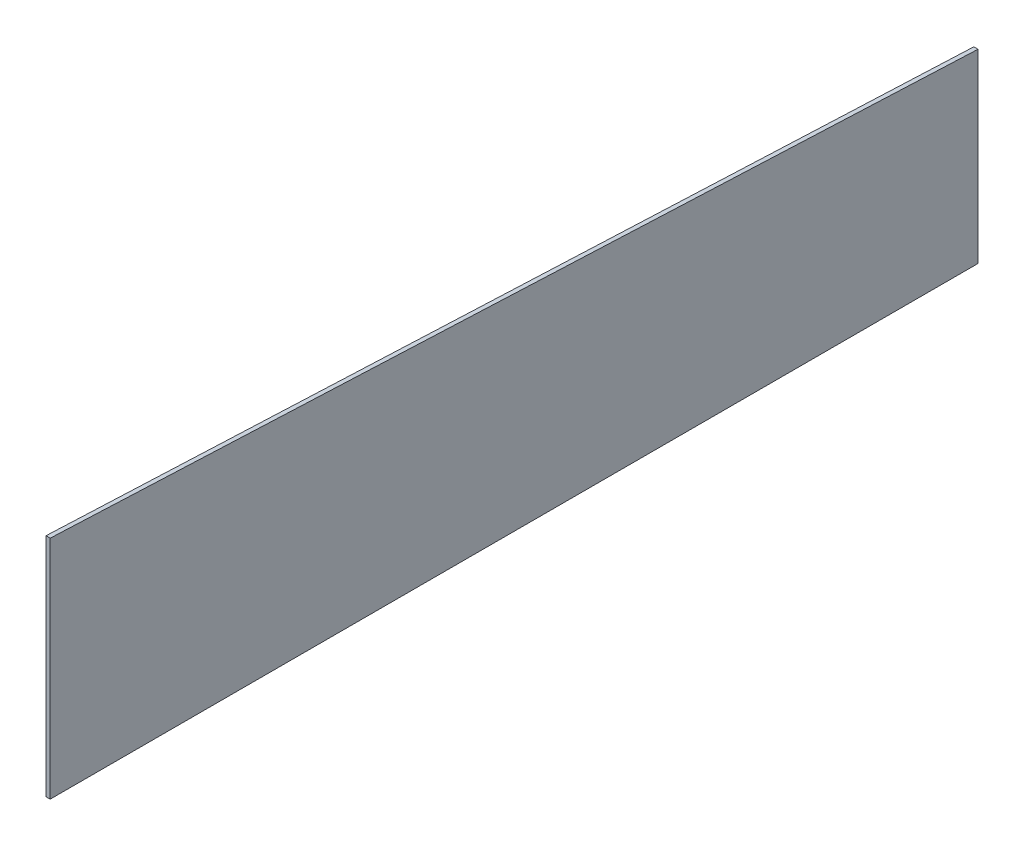
ISO-10303-21;
HEADER;
FILE_DESCRIPTION(('STEP AP214'),'2;1');
FILE_NAME('part.step','',(''),(''),'','','');
FILE_SCHEMA(('AUTOMOTIVE_DESIGN { 1 0 10303 214 1 1 1 1 }'));
ENDSEC;
DATA;
#1=APPLICATION_CONTEXT('core data for automotive mechanical design processes');
#2=APPLICATION_PROTOCOL_DEFINITION('international standard','automotive_design',2000,#1);
#3=PRODUCT_CONTEXT('',#1,'mechanical');
#4=PRODUCT('Part','Part','',(#3));
#5=PRODUCT_RELATED_PRODUCT_CATEGORY('part','',(#4));
#6=PRODUCT_DEFINITION_FORMATION('','',#4);
#7=PRODUCT_DEFINITION_CONTEXT('part definition',#1,'design');
#8=PRODUCT_DEFINITION('design','',#6,#7);
#9=PRODUCT_DEFINITION_SHAPE('','',#8);
#10=(LENGTH_UNIT() NAMED_UNIT(*) SI_UNIT(.MILLI.,.METRE.));
#11=(NAMED_UNIT(*) PLANE_ANGLE_UNIT() SI_UNIT($,.RADIAN.));
#12=(NAMED_UNIT(*) SI_UNIT($,.STERADIAN.) SOLID_ANGLE_UNIT());
#13=UNCERTAINTY_MEASURE_WITH_UNIT(LENGTH_MEASURE(1.E-05),#10,'distance_accuracy_value','');
#14=(GEOMETRIC_REPRESENTATION_CONTEXT(3) GLOBAL_UNCERTAINTY_ASSIGNED_CONTEXT((#13)) GLOBAL_UNIT_ASSIGNED_CONTEXT((#10,
#11,#12)) REPRESENTATION_CONTEXT('',''));
#15=CARTESIAN_POINT('',(0.,0.,0.));
#16=DIRECTION('',(0.,0.,1.));
#17=DIRECTION('',(1.,0.,0.));
#18=AXIS2_PLACEMENT_3D('',#15,#16,#17);
#19=CARTESIAN_POINT('',(3.175,0.,0.));
#20=DIRECTION('',(0.,1.,0.));
#21=DIRECTION('',(0.,0.,1.));
#22=AXIS2_PLACEMENT_3D('',#19,#20,#21);
#23=PLANE('',#22);
#24=DIRECTION('',(0.,0.,-1.));
#25=VECTOR('',#24,1.);
#26=CARTESIAN_POINT('',(0.,0.,0.));
#27=LINE('',#26,#25);
#28=CARTESIAN_POINT('',(0.,0.,0.));
#29=VERTEX_POINT('',#28);
#30=CARTESIAN_POINT('',(0.,0.,-698.5));
#31=VERTEX_POINT('',#30);
#32=EDGE_CURVE('E95',#29,#31,#27,.T.);
#33=ORIENTED_EDGE('',*,*,#32,.T.);
#34=DIRECTION('',(-1.,0.,0.));
#35=VECTOR('',#34,1.);
#36=CARTESIAN_POINT('',(3.175,0.,-698.5));
#37=LINE('',#36,#35);
#38=CARTESIAN_POINT('',(3.175,0.,-698.5));
#39=VERTEX_POINT('',#38);
#40=EDGE_CURVE('E48',#39,#31,#37,.T.);
#41=ORIENTED_EDGE('',*,*,#40,.F.);
#42=DIRECTION('',(0.,0.,-1.));
#43=VECTOR('',#42,1.);
#44=CARTESIAN_POINT('',(3.175,0.,0.));
#45=LINE('',#44,#43);
#46=CARTESIAN_POINT('',(3.175,0.,0.));
#47=VERTEX_POINT('',#46);
#48=EDGE_CURVE('E87',#47,#39,#45,.T.);
#49=ORIENTED_EDGE('',*,*,#48,.F.);
#50=DIRECTION('',(-1.,0.,0.));
#51=VECTOR('',#50,1.);
#52=CARTESIAN_POINT('',(3.175,0.,0.));
#53=LINE('',#52,#51);
#54=EDGE_CURVE('E11',#47,#29,#53,.T.);
#55=ORIENTED_EDGE('',*,*,#54,.T.);
#56=EDGE_LOOP('',(#33,#41,#49,#55));
#57=FACE_BOUND('',#56,.T.);
#58=ADVANCED_FACE('F39',(#57),#23,.F.);
#59=CARTESIAN_POINT('',(3.175,0.,-698.5));
#60=DIRECTION('',(0.,0.,1.));
#61=DIRECTION('',(0.,-1.,0.));
#62=AXIS2_PLACEMENT_3D('',#59,#60,#61);
#63=PLANE('',#62);
#64=DIRECTION('',(0.,1.,0.));
#65=VECTOR('',#64,1.);
#66=CARTESIAN_POINT('',(0.,0.,-698.5));
#67=LINE('',#66,#65);
#68=CARTESIAN_POINT('',(0.,139.7,-698.5));
#69=VERTEX_POINT('',#68);
#70=EDGE_CURVE('E74',#31,#69,#67,.T.);
#71=ORIENTED_EDGE('',*,*,#70,.T.);
#72=DIRECTION('',(-1.,0.,0.));
#73=VECTOR('',#72,1.);
#74=CARTESIAN_POINT('',(3.175,139.7,-698.5));
#75=LINE('',#74,#73);
#76=CARTESIAN_POINT('',(3.175,139.7,-698.5));
#77=VERTEX_POINT('',#76);
#78=EDGE_CURVE('E97',#77,#69,#75,.T.);
#79=ORIENTED_EDGE('',*,*,#78,.F.);
#80=DIRECTION('',(0.,1.,0.));
#81=VECTOR('',#80,1.);
#82=CARTESIAN_POINT('',(3.175,0.,-698.5));
#83=LINE('',#82,#81);
#84=EDGE_CURVE('E91',#39,#77,#83,.T.);
#85=ORIENTED_EDGE('',*,*,#84,.F.);
#86=ORIENTED_EDGE('',*,*,#40,.T.);
#87=EDGE_LOOP('',(#71,#79,#85,#86));
#88=FACE_BOUND('',#87,.T.);
#89=ADVANCED_FACE('F98',(#88),#63,.F.);
#90=CARTESIAN_POINT('',(3.175,170.197168621596,0.));
#91=DIRECTION('',(0.,-0.999048221581858,0.0436193873653361));
#92=DIRECTION('',(0.,-0.0436193873653361,-0.999048221581858));
#93=AXIS2_PLACEMENT_3D('',#90,#91,#92);
#94=PLANE('',#93);
#95=DIRECTION('',(0.,0.0436193873653361,0.999048221581858));
#96=VECTOR('',#95,1.);
#97=CARTESIAN_POINT('',(0.,170.197168621596,0.));
#98=LINE('',#97,#96);
#99=CARTESIAN_POINT('',(0.,170.197168621596,0.));
#100=VERTEX_POINT('',#99);
#101=EDGE_CURVE('E81',#69,#100,#98,.T.);
#102=ORIENTED_EDGE('',*,*,#101,.T.);
#103=DIRECTION('',(-1.,0.,0.));
#104=VECTOR('',#103,1.);
#105=CARTESIAN_POINT('',(3.175,170.197168621596,0.));
#106=LINE('',#105,#104);
#107=CARTESIAN_POINT('',(3.175,170.197168621596,0.));
#108=VERTEX_POINT('',#107);
#109=EDGE_CURVE('E104',#108,#100,#106,.T.);
#110=ORIENTED_EDGE('',*,*,#109,.F.);
#111=DIRECTION('',(0.,0.0436193873653361,0.999048221581858));
#112=VECTOR('',#111,1.);
#113=CARTESIAN_POINT('',(3.175,170.197168621596,0.));
#114=LINE('',#113,#112);
#115=EDGE_CURVE('E101',#77,#108,#114,.T.);
#116=ORIENTED_EDGE('',*,*,#115,.F.);
#117=ORIENTED_EDGE('',*,*,#78,.T.);
#118=EDGE_LOOP('',(#102,#110,#116,#117));
#119=FACE_BOUND('',#118,.T.);
#120=ADVANCED_FACE('F120',(#119),#94,.F.);
#121=CARTESIAN_POINT('',(3.175,170.197168621596,0.));
#122=DIRECTION('',(0.,0.,-1.));
#123=DIRECTION('',(-1.,0.,0.));
#124=AXIS2_PLACEMENT_3D('',#121,#122,#123);
#125=PLANE('',#124);
#126=DIRECTION('',(0.,-1.,0.));
#127=VECTOR('',#126,1.);
#128=CARTESIAN_POINT('',(0.,170.197168621596,0.));
#129=LINE('',#128,#127);
#130=EDGE_CURVE('E114',#100,#29,#129,.T.);
#131=ORIENTED_EDGE('',*,*,#130,.T.);
#132=ORIENTED_EDGE('',*,*,#54,.F.);
#133=DIRECTION('',(0.,-1.,0.));
#134=VECTOR('',#133,1.);
#135=CARTESIAN_POINT('',(3.175,0.,0.));
#136=LINE('',#135,#134);
#137=EDGE_CURVE('E56',#108,#47,#136,.T.);
#138=ORIENTED_EDGE('',*,*,#137,.F.);
#139=ORIENTED_EDGE('',*,*,#109,.T.);
#140=EDGE_LOOP('',(#131,#132,#138,#139));
#141=FACE_BOUND('',#140,.T.);
#142=ADVANCED_FACE('F124',(#141),#125,.F.);
#143=CARTESIAN_POINT('',(3.175,0.,0.));
#144=DIRECTION('',(-1.,0.,0.));
#145=DIRECTION('',(0.,0.,1.));
#146=AXIS2_PLACEMENT_3D('',#143,#144,#145);
#147=PLANE('',#146);
#148=ORIENTED_EDGE('',*,*,#137,.T.);
#149=ORIENTED_EDGE('',*,*,#48,.T.);
#150=ORIENTED_EDGE('',*,*,#84,.T.);
#151=ORIENTED_EDGE('',*,*,#115,.T.);
#152=EDGE_LOOP('',(#148,#149,#150,#151));
#153=FACE_BOUND('',#152,.T.);
#154=ADVANCED_FACE('F89',(#153),#147,.F.);
#155=CARTESIAN_POINT('',(0.,0.,0.));
#156=DIRECTION('',(-1.,0.,0.));
#157=DIRECTION('',(0.,0.,1.));
#158=AXIS2_PLACEMENT_3D('',#155,#156,#157);
#159=PLANE('',#158);
#160=ORIENTED_EDGE('',*,*,#32,.F.);
#161=ORIENTED_EDGE('',*,*,#130,.F.);
#162=ORIENTED_EDGE('',*,*,#101,.F.);
#163=ORIENTED_EDGE('',*,*,#70,.F.);
#164=EDGE_LOOP('',(#160,#161,#162,#163));
#165=FACE_BOUND('',#164,.T.);
#166=ADVANCED_FACE('F123',(#165),#159,.T.);
#167=CLOSED_SHELL('',(#58,#89,#120,#142,#154,#166));
#168=MANIFOLD_SOLID_BREP('B2',#167);
#169=ADVANCED_BREP_SHAPE_REPRESENTATION('',(#18,#168),#14);
#170=SHAPE_DEFINITION_REPRESENTATION(#9,#169);
ENDSEC;
END-ISO-10303-21;
